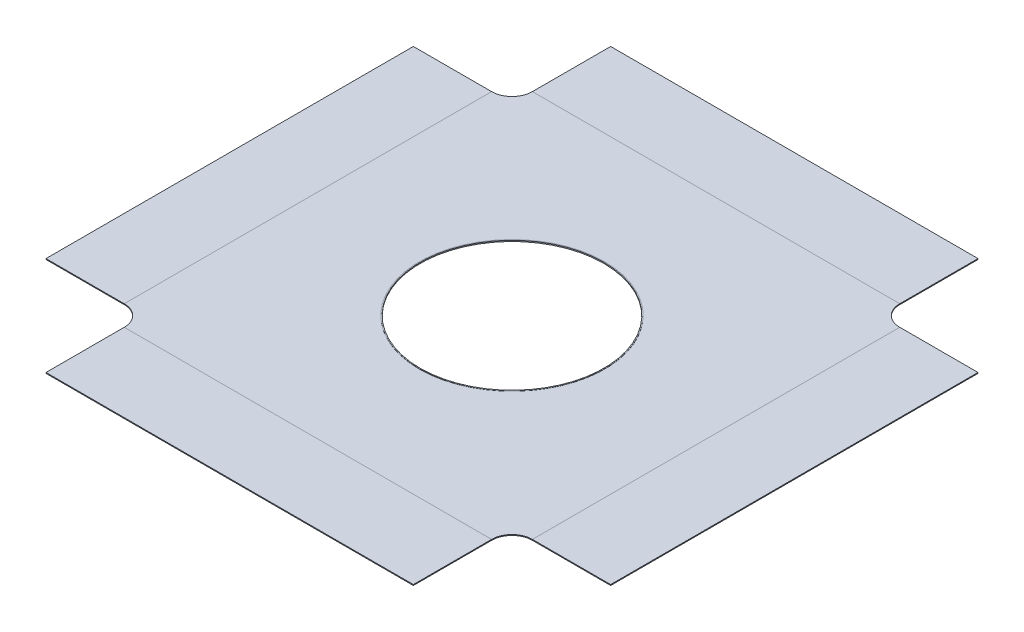
ISO-10303-21;
HEADER;
FILE_DESCRIPTION(('STEP AP214'),'2;1');
FILE_NAME('part.step','',(''),(''),'','','');
FILE_SCHEMA(('AUTOMOTIVE_DESIGN { 1 0 10303 214 1 1 1 1 }'));
ENDSEC;
DATA;
#1=APPLICATION_CONTEXT('core data for automotive mechanical design processes');
#2=APPLICATION_PROTOCOL_DEFINITION('international standard','automotive_design',2000,#1);
#3=PRODUCT_CONTEXT('',#1,'mechanical');
#4=PRODUCT('Part','Part','',(#3));
#5=PRODUCT_RELATED_PRODUCT_CATEGORY('part','',(#4));
#6=PRODUCT_DEFINITION_FORMATION('','',#4);
#7=PRODUCT_DEFINITION_CONTEXT('part definition',#1,'design');
#8=PRODUCT_DEFINITION('design','',#6,#7);
#9=PRODUCT_DEFINITION_SHAPE('','',#8);
#10=(LENGTH_UNIT() NAMED_UNIT(*) SI_UNIT(.MILLI.,.METRE.));
#11=(NAMED_UNIT(*) PLANE_ANGLE_UNIT() SI_UNIT($,.RADIAN.));
#12=(NAMED_UNIT(*) SI_UNIT($,.STERADIAN.) SOLID_ANGLE_UNIT());
#13=UNCERTAINTY_MEASURE_WITH_UNIT(LENGTH_MEASURE(1.E-05),#10,'distance_accuracy_value','');
#14=(GEOMETRIC_REPRESENTATION_CONTEXT(3) GLOBAL_UNCERTAINTY_ASSIGNED_CONTEXT((#13)) GLOBAL_UNIT_ASSIGNED_CONTEXT((#10,
#11,#12)) REPRESENTATION_CONTEXT('',''));
#15=CARTESIAN_POINT('',(0.,0.,0.));
#16=DIRECTION('',(0.,0.,1.));
#17=DIRECTION('',(1.,0.,0.));
#18=AXIS2_PLACEMENT_3D('',#15,#16,#17);
#19=CARTESIAN_POINT('',(0.,0.4064,0.));
#20=DIRECTION('',(0.,-1.,0.));
#21=DIRECTION('',(0.,0.,-1.));
#22=AXIS2_PLACEMENT_3D('',#19,#20,#21);
#23=PLANE('',#22);
#24=DIRECTION('',(-1.,0.,0.));
#25=VECTOR('',#24,1.);
#26=CARTESIAN_POINT('',(0.,0.4064,190.5));
#27=LINE('',#26,#25);
#28=CARTESIAN_POINT('',(171.449999999998,0.4064,190.5));
#29=VERTEX_POINT('',#28);
#30=CARTESIAN_POINT('',(-171.450000000002,0.4064,190.5));
#31=VERTEX_POINT('',#30);
#32=EDGE_CURVE('E57',#29,#31,#27,.T.);
#33=ORIENTED_EDGE('',*,*,#32,.F.);
#34=CARTESIAN_POINT('',(190.499999999998,0.4064,190.5));
#35=DIRECTION('',(0.,-1.,0.));
#36=DIRECTION('',(0.,0.,-1.));
#37=AXIS2_PLACEMENT_3D('',#34,#35,#36);
#38=CIRCLE('',#37,19.05);
#39=CARTESIAN_POINT('',(190.499999999998,0.4064,171.45));
#40=VERTEX_POINT('',#39);
#41=EDGE_CURVE('E327',#29,#40,#38,.T.);
#42=ORIENTED_EDGE('',*,*,#41,.T.);
#43=DIRECTION('',(0.,0.,1.));
#44=VECTOR('',#43,1.);
#45=CARTESIAN_POINT('',(190.499999999999,0.4064,1.05975834168764E-12));
#46=LINE('',#45,#44);
#47=CARTESIAN_POINT('',(190.5,0.4064,-171.45));
#48=VERTEX_POINT('',#47);
#49=EDGE_CURVE('E354',#48,#40,#46,.T.);
#50=ORIENTED_EDGE('',*,*,#49,.F.);
#51=CARTESIAN_POINT('',(190.5,0.4064,-190.5));
#52=DIRECTION('',(0.,-1.,0.));
#53=DIRECTION('',(0.,0.,-1.));
#54=AXIS2_PLACEMENT_3D('',#51,#52,#53);
#55=CIRCLE('',#54,19.05);
#56=CARTESIAN_POINT('',(171.45,0.4064,-190.5));
#57=VERTEX_POINT('',#56);
#58=EDGE_CURVE('E335',#48,#57,#55,.T.);
#59=ORIENTED_EDGE('',*,*,#58,.T.);
#60=DIRECTION('',(1.,0.,0.));
#61=VECTOR('',#60,1.);
#62=CARTESIAN_POINT('',(0.,0.4064,-190.5));
#63=LINE('',#62,#61);
#64=CARTESIAN_POINT('',(-171.449999999999,0.4064,-190.5));
#65=VERTEX_POINT('',#64);
#66=EDGE_CURVE('E64',#65,#57,#63,.T.);
#67=ORIENTED_EDGE('',*,*,#66,.F.);
#68=CARTESIAN_POINT('',(-190.499999999999,0.4064,-190.5));
#69=DIRECTION('',(0.,-1.,0.));
#70=DIRECTION('',(0.,0.,-1.));
#71=AXIS2_PLACEMENT_3D('',#68,#69,#70);
#72=CIRCLE('',#71,19.05);
#73=CARTESIAN_POINT('',(-190.499999999999,0.4064,-171.45));
#74=VERTEX_POINT('',#73);
#75=EDGE_CURVE('E313',#65,#74,#72,.T.);
#76=ORIENTED_EDGE('',*,*,#75,.T.);
#77=DIRECTION('',(0.,0.,-1.));
#78=VECTOR('',#77,1.);
#79=CARTESIAN_POINT('',(-190.500000000001,0.4064,-1.45338286860021E-12));
#80=LINE('',#79,#78);
#81=CARTESIAN_POINT('',(-190.500000000002,0.4064,171.45));
#82=VERTEX_POINT('',#81);
#83=EDGE_CURVE('E345',#82,#74,#80,.T.);
#84=ORIENTED_EDGE('',*,*,#83,.F.);
#85=CARTESIAN_POINT('',(-190.500000000002,0.4064,190.5));
#86=DIRECTION('',(0.,-1.,0.));
#87=DIRECTION('',(0.,0.,-1.));
#88=AXIS2_PLACEMENT_3D('',#85,#86,#87);
#89=CIRCLE('',#88,19.05);
#90=EDGE_CURVE('E324',#82,#31,#89,.T.);
#91=ORIENTED_EDGE('',*,*,#90,.T.);
#92=EDGE_LOOP('',(#33,#42,#50,#59,#67,#76,#84,#91));
#93=FACE_BOUND('',#92,.T.);
#94=CARTESIAN_POINT('',(0.,0.4064,0.));
#95=DIRECTION('',(0.,-1.,0.));
#96=DIRECTION('',(0.,0.,-1.));
#97=AXIS2_PLACEMENT_3D('',#94,#95,#96);
#98=CIRCLE('',#97,86.58225);
#99=CARTESIAN_POINT('',(0.,0.4064,-86.58225));
#100=VERTEX_POINT('',#99);
#101=EDGE_CURVE('E13',#100,#100,#98,.F.);
#102=ORIENTED_EDGE('',*,*,#101,.F.);
#103=EDGE_LOOP('',(#102));
#104=FACE_BOUND('',#103,.T.);
#105=ADVANCED_FACE('F48',(#93,#104),#23,.F.);
#106=DIRECTION('',(0.,0.,-1.));
#107=VECTOR('',#106,1.);
#108=CARTESIAN_POINT('',(171.449999999997,0.4064,263.525000000002));
#109=LINE('',#108,#107);
#110=CARTESIAN_POINT('',(171.449999999997,0.4064,263.525000000002));
#111=VERTEX_POINT('',#110);
#112=EDGE_CURVE('E192',#111,#29,#109,.T.);
#113=ORIENTED_EDGE('',*,*,#112,.T.);
#114=ORIENTED_EDGE('',*,*,#32,.T.);
#115=DIRECTION('',(0.,0.,-1.));
#116=VECTOR('',#115,1.);
#117=CARTESIAN_POINT('',(-171.450000000003,0.4064,263.524999999998));
#118=LINE('',#117,#116);
#119=CARTESIAN_POINT('',(-171.450000000003,0.4064,263.524999999998));
#120=VERTEX_POINT('',#119);
#121=EDGE_CURVE('E178',#120,#31,#118,.T.);
#122=ORIENTED_EDGE('',*,*,#121,.F.);
#123=DIRECTION('',(-1.,0.,0.));
#124=VECTOR('',#123,1.);
#125=CARTESIAN_POINT('',(171.449999999997,0.4064,263.525000000002));
#126=LINE('',#125,#124);
#127=EDGE_CURVE('E163',#111,#120,#126,.T.);
#128=ORIENTED_EDGE('',*,*,#127,.F.);
#129=EDGE_LOOP('',(#113,#114,#122,#128));
#130=FACE_BOUND('',#129,.T.);
#131=ADVANCED_FACE('F179',(#130),#23,.F.);
#132=CARTESIAN_POINT('',(0.,-0.4064,0.));
#133=DIRECTION('',(0.,-1.,0.));
#134=DIRECTION('',(0.,0.,-1.));
#135=AXIS2_PLACEMENT_3D('',#132,#133,#134);
#136=PLANE('',#135);
#137=CARTESIAN_POINT('',(0.,-0.406400000000001,0.));
#138=DIRECTION('',(0.,-1.,0.));
#139=DIRECTION('',(0.,0.,-1.));
#140=AXIS2_PLACEMENT_3D('',#137,#138,#139);
#141=CIRCLE('',#140,85.725);
#142=CARTESIAN_POINT('',(0.,-0.406400000000001,-85.725));
#143=VERTEX_POINT('',#142);
#144=EDGE_CURVE('E186',#143,#143,#141,.T.);
#145=ORIENTED_EDGE('',*,*,#144,.F.);
#146=EDGE_LOOP('',(#145));
#147=FACE_BOUND('',#146,.T.);
#148=CARTESIAN_POINT('',(190.499999999998,-0.4064,190.5));
#149=DIRECTION('',(0.,-1.,0.));
#150=DIRECTION('',(0.,0.,-1.));
#151=AXIS2_PLACEMENT_3D('',#148,#149,#150);
#152=CIRCLE('',#151,19.05);
#153=CARTESIAN_POINT('',(190.499999999998,-0.4064,171.45));
#154=VERTEX_POINT('',#153);
#155=CARTESIAN_POINT('',(171.449999999998,-0.4064,190.5));
#156=VERTEX_POINT('',#155);
#157=EDGE_CURVE('E331',#154,#156,#152,.F.);
#158=ORIENTED_EDGE('',*,*,#157,.T.);
#159=DIRECTION('',(-1.,0.,0.));
#160=VECTOR('',#159,1.);
#161=CARTESIAN_POINT('',(0.,-0.4064,190.5));
#162=LINE('',#161,#160);
#163=CARTESIAN_POINT('',(-171.450000000002,-0.4064,190.5));
#164=VERTEX_POINT('',#163);
#165=EDGE_CURVE('E350',#156,#164,#162,.T.);
#166=ORIENTED_EDGE('',*,*,#165,.T.);
#167=CARTESIAN_POINT('',(-190.500000000002,-0.4064,190.5));
#168=DIRECTION('',(0.,-1.,0.));
#169=DIRECTION('',(0.,0.,-1.));
#170=AXIS2_PLACEMENT_3D('',#167,#168,#169);
#171=CIRCLE('',#170,19.05);
#172=CARTESIAN_POINT('',(-190.500000000002,-0.4064,171.45));
#173=VERTEX_POINT('',#172);
#174=EDGE_CURVE('E320',#164,#173,#171,.F.);
#175=ORIENTED_EDGE('',*,*,#174,.T.);
#176=DIRECTION('',(0.,0.,-1.));
#177=VECTOR('',#176,1.);
#178=CARTESIAN_POINT('',(-190.500000000001,-0.4064,-1.45338286860021E-12));
#179=LINE('',#178,#177);
#180=CARTESIAN_POINT('',(-190.499999999999,-0.4064,-171.45));
#181=VERTEX_POINT('',#180);
#182=EDGE_CURVE('E341',#173,#181,#179,.T.);
#183=ORIENTED_EDGE('',*,*,#182,.T.);
#184=CARTESIAN_POINT('',(-190.499999999999,-0.4064,-190.5));
#185=DIRECTION('',(0.,-1.,0.));
#186=DIRECTION('',(0.,0.,-1.));
#187=AXIS2_PLACEMENT_3D('',#184,#185,#186);
#188=CIRCLE('',#187,19.05);
#189=CARTESIAN_POINT('',(-171.449999999999,-0.4064,-190.5));
#190=VERTEX_POINT('',#189);
#191=EDGE_CURVE('E317',#181,#190,#188,.F.);
#192=ORIENTED_EDGE('',*,*,#191,.T.);
#193=DIRECTION('',(1.,0.,0.));
#194=VECTOR('',#193,1.);
#195=CARTESIAN_POINT('',(0.,-0.4064,-190.5));
#196=LINE('',#195,#194);
#197=CARTESIAN_POINT('',(171.45,-0.4064,-190.5));
#198=VERTEX_POINT('',#197);
#199=EDGE_CURVE('E72',#190,#198,#196,.T.);
#200=ORIENTED_EDGE('',*,*,#199,.T.);
#201=CARTESIAN_POINT('',(190.5,-0.4064,-190.5));
#202=DIRECTION('',(0.,-1.,0.));
#203=DIRECTION('',(0.,0.,-1.));
#204=AXIS2_PLACEMENT_3D('',#201,#202,#203);
#205=CIRCLE('',#204,19.05);
#206=CARTESIAN_POINT('',(190.5,-0.4064,-171.45));
#207=VERTEX_POINT('',#206);
#208=EDGE_CURVE('E338',#198,#207,#205,.F.);
#209=ORIENTED_EDGE('',*,*,#208,.T.);
#210=DIRECTION('',(0.,0.,1.));
#211=VECTOR('',#210,1.);
#212=CARTESIAN_POINT('',(190.499999999999,-0.4064,1.05975834168764E-12));
#213=LINE('',#212,#211);
#214=EDGE_CURVE('E358',#207,#154,#213,.T.);
#215=ORIENTED_EDGE('',*,*,#214,.T.);
#216=EDGE_LOOP('',(#158,#166,#175,#183,#192,#200,#209,#215));
#217=FACE_BOUND('',#216,.T.);
#218=ADVANCED_FACE('F403',(#147,#217),#136,.T.);
#219=DIRECTION('',(-1.,0.,0.));
#220=VECTOR('',#219,1.);
#221=CARTESIAN_POINT('',(263.525,0.4064,-171.45));
#222=LINE('',#221,#220);
#223=CARTESIAN_POINT('',(263.525,0.4064,-171.45));
#224=VERTEX_POINT('',#223);
#225=EDGE_CURVE('E204',#224,#48,#222,.T.);
#226=ORIENTED_EDGE('',*,*,#225,.T.);
#227=ORIENTED_EDGE('',*,*,#49,.T.);
#228=DIRECTION('',(1.,0.,0.));
#229=VECTOR('',#228,1.);
#230=CARTESIAN_POINT('',(-171.45,0.4064,171.45));
#231=LINE('',#230,#229);
#232=CARTESIAN_POINT('',(263.525,0.4064,171.45));
#233=VERTEX_POINT('',#232);
#234=EDGE_CURVE('E268',#40,#233,#231,.T.);
#235=ORIENTED_EDGE('',*,*,#234,.T.);
#236=DIRECTION('',(0.,0.,1.));
#237=VECTOR('',#236,1.);
#238=CARTESIAN_POINT('',(263.525,0.4064,-171.45));
#239=LINE('',#238,#237);
#240=EDGE_CURVE('E209',#224,#233,#239,.T.);
#241=ORIENTED_EDGE('',*,*,#240,.F.);
#242=EDGE_LOOP('',(#226,#227,#235,#241));
#243=FACE_BOUND('',#242,.T.);
#244=ADVANCED_FACE('F404',(#243),#23,.F.);
#245=ORIENTED_EDGE('',*,*,#165,.F.);
#246=DIRECTION('',(0.,0.,-1.));
#247=VECTOR('',#246,1.);
#248=CARTESIAN_POINT('',(171.449999999997,-0.4064,263.525000000002));
#249=LINE('',#248,#247);
#250=CARTESIAN_POINT('',(171.449999999997,-0.4064,263.525000000002));
#251=VERTEX_POINT('',#250);
#252=EDGE_CURVE('E197',#251,#156,#249,.T.);
#253=ORIENTED_EDGE('',*,*,#252,.F.);
#254=DIRECTION('',(1.,0.,0.));
#255=VECTOR('',#254,1.);
#256=CARTESIAN_POINT('',(-171.450000000003,-0.4064,263.524999999998));
#257=LINE('',#256,#255);
#258=CARTESIAN_POINT('',(-171.450000000003,-0.4064,263.524999999998));
#259=VERTEX_POINT('',#258);
#260=EDGE_CURVE('E191',#259,#251,#257,.T.);
#261=ORIENTED_EDGE('',*,*,#260,.F.);
#262=DIRECTION('',(0.,0.,-1.));
#263=VECTOR('',#262,1.);
#264=CARTESIAN_POINT('',(-171.450000000003,-0.4064,263.524999999998));
#265=LINE('',#264,#263);
#266=EDGE_CURVE('E185',#259,#164,#265,.T.);
#267=ORIENTED_EDGE('',*,*,#266,.T.);
#268=EDGE_LOOP('',(#245,#253,#261,#267));
#269=FACE_BOUND('',#268,.T.);
#270=ADVANCED_FACE('F421',(#269),#136,.T.);
#271=DIRECTION('',(0.,0.,1.));
#272=VECTOR('',#271,1.);
#273=CARTESIAN_POINT('',(-171.449999999999,0.4064,-263.525000000001));
#274=LINE('',#273,#272);
#275=CARTESIAN_POINT('',(-171.449999999999,0.4064,-263.525000000001));
#276=VERTEX_POINT('',#275);
#277=EDGE_CURVE('E236',#276,#65,#274,.T.);
#278=ORIENTED_EDGE('',*,*,#277,.T.);
#279=ORIENTED_EDGE('',*,*,#66,.T.);
#280=DIRECTION('',(0.,0.,-1.));
#281=VECTOR('',#280,1.);
#282=CARTESIAN_POINT('',(171.45,0.4064,171.45));
#283=LINE('',#282,#281);
#284=CARTESIAN_POINT('',(171.450000000001,0.4064,-263.524999999999));
#285=VERTEX_POINT('',#284);
#286=EDGE_CURVE('E264',#57,#285,#283,.T.);
#287=ORIENTED_EDGE('',*,*,#286,.T.);
#288=DIRECTION('',(1.,0.,0.));
#289=VECTOR('',#288,1.);
#290=CARTESIAN_POINT('',(-171.449999999999,0.4064,-263.525000000001));
#291=LINE('',#290,#289);
#292=EDGE_CURVE('E232',#276,#285,#291,.T.);
#293=ORIENTED_EDGE('',*,*,#292,.F.);
#294=EDGE_LOOP('',(#278,#279,#287,#293));
#295=FACE_BOUND('',#294,.T.);
#296=ADVANCED_FACE('F412',(#295),#23,.F.);
#297=ORIENTED_EDGE('',*,*,#214,.F.);
#298=DIRECTION('',(-1.,0.,0.));
#299=VECTOR('',#298,1.);
#300=CARTESIAN_POINT('',(263.525,-0.4064,-171.45));
#301=LINE('',#300,#299);
#302=CARTESIAN_POINT('',(263.525,-0.4064,-171.45));
#303=VERTEX_POINT('',#302);
#304=EDGE_CURVE('E175',#303,#207,#301,.T.);
#305=ORIENTED_EDGE('',*,*,#304,.F.);
#306=DIRECTION('',(0.,0.,-1.));
#307=VECTOR('',#306,1.);
#308=CARTESIAN_POINT('',(263.525,-0.4064,171.45));
#309=LINE('',#308,#307);
#310=CARTESIAN_POINT('',(263.525,-0.4064,171.45));
#311=VERTEX_POINT('',#310);
#312=EDGE_CURVE('E217',#311,#303,#309,.T.);
#313=ORIENTED_EDGE('',*,*,#312,.F.);
#314=DIRECTION('',(1.,0.,0.));
#315=VECTOR('',#314,1.);
#316=CARTESIAN_POINT('',(-171.45,-0.4064,171.45));
#317=LINE('',#316,#315);
#318=EDGE_CURVE('E280',#154,#311,#317,.T.);
#319=ORIENTED_EDGE('',*,*,#318,.F.);
#320=EDGE_LOOP('',(#297,#305,#313,#319));
#321=FACE_BOUND('',#320,.T.);
#322=ADVANCED_FACE('F410',(#321),#136,.T.);
#323=CARTESIAN_POINT('',(-263.525,0.4064,171.45));
#324=VERTEX_POINT('',#323);
#325=EDGE_CURVE('E269',#324,#82,#231,.T.);
#326=ORIENTED_EDGE('',*,*,#325,.T.);
#327=ORIENTED_EDGE('',*,*,#83,.T.);
#328=DIRECTION('',(1.,0.,0.));
#329=VECTOR('',#328,1.);
#330=CARTESIAN_POINT('',(-171.45,0.4064,-171.45));
#331=LINE('',#330,#329);
#332=CARTESIAN_POINT('',(-263.525,0.4064,-171.45));
#333=VERTEX_POINT('',#332);
#334=EDGE_CURVE('E260',#333,#74,#331,.T.);
#335=ORIENTED_EDGE('',*,*,#334,.F.);
#336=DIRECTION('',(0.,0.,-1.));
#337=VECTOR('',#336,1.);
#338=CARTESIAN_POINT('',(-263.525,0.4064,171.45));
#339=LINE('',#338,#337);
#340=EDGE_CURVE('E255',#324,#333,#339,.T.);
#341=ORIENTED_EDGE('',*,*,#340,.F.);
#342=EDGE_LOOP('',(#326,#327,#335,#341));
#343=FACE_BOUND('',#342,.T.);
#344=ADVANCED_FACE('F399',(#343),#23,.F.);
#345=ORIENTED_EDGE('',*,*,#199,.F.);
#346=DIRECTION('',(0.,0.,1.));
#347=VECTOR('',#346,1.);
#348=CARTESIAN_POINT('',(-171.449999999999,-0.4064,-263.525000000001));
#349=LINE('',#348,#347);
#350=CARTESIAN_POINT('',(-171.449999999999,-0.4064,-263.525000000001));
#351=VERTEX_POINT('',#350);
#352=EDGE_CURVE('E239',#351,#190,#349,.T.);
#353=ORIENTED_EDGE('',*,*,#352,.F.);
#354=DIRECTION('',(-1.,0.,0.));
#355=VECTOR('',#354,1.);
#356=CARTESIAN_POINT('',(171.450000000001,-0.4064,-263.524999999999));
#357=LINE('',#356,#355);
#358=CARTESIAN_POINT('',(171.450000000001,-0.4064,-263.524999999999));
#359=VERTEX_POINT('',#358);
#360=EDGE_CURVE('E226',#359,#351,#357,.T.);
#361=ORIENTED_EDGE('',*,*,#360,.F.);
#362=DIRECTION('',(0.,0.,-1.));
#363=VECTOR('',#362,1.);
#364=CARTESIAN_POINT('',(171.45,-0.4064,171.45));
#365=LINE('',#364,#363);
#366=EDGE_CURVE('E277',#198,#359,#365,.T.);
#367=ORIENTED_EDGE('',*,*,#366,.F.);
#368=EDGE_LOOP('',(#345,#353,#361,#367));
#369=FACE_BOUND('',#368,.T.);
#370=ADVANCED_FACE('F409',(#369),#136,.T.);
#371=CARTESIAN_POINT('',(-171.45,0.4064,171.45));
#372=DIRECTION('',(0.,0.,-1.));
#373=DIRECTION('',(-1.,0.,0.));
#374=AXIS2_PLACEMENT_3D('',#371,#372,#373);
#375=PLANE('',#374);
#376=CARTESIAN_POINT('',(-263.525,-0.4064,171.45));
#377=VERTEX_POINT('',#376);
#378=EDGE_CURVE('E265',#377,#173,#317,.T.);
#379=ORIENTED_EDGE('',*,*,#378,.T.);
#380=DIRECTION('',(0.,-1.,0.));
#381=VECTOR('',#380,1.);
#382=CARTESIAN_POINT('',(-190.500000000002,0.4064,171.45));
#383=LINE('',#382,#381);
#384=EDGE_CURVE('E294',#173,#82,#383,.F.);
#385=ORIENTED_EDGE('',*,*,#384,.T.);
#386=ORIENTED_EDGE('',*,*,#325,.F.);
#387=DIRECTION('',(0.,1.,0.));
#388=VECTOR('',#387,1.);
#389=CARTESIAN_POINT('',(-263.525,-0.4064,171.45));
#390=LINE('',#389,#388);
#391=EDGE_CURVE('E251',#377,#324,#390,.T.);
#392=ORIENTED_EDGE('',*,*,#391,.F.);
#393=EDGE_LOOP('',(#379,#385,#386,#392));
#394=FACE_BOUND('',#393,.T.);
#395=ADVANCED_FACE('F417',(#394),#375,.F.);
#396=ORIENTED_EDGE('',*,*,#234,.F.);
#397=DIRECTION('',(0.,1.,0.));
#398=VECTOR('',#397,1.);
#399=CARTESIAN_POINT('',(190.499999999998,-0.4064,171.45));
#400=LINE('',#399,#398);
#401=EDGE_CURVE('E302',#40,#154,#400,.F.);
#402=ORIENTED_EDGE('',*,*,#401,.T.);
#403=ORIENTED_EDGE('',*,*,#318,.T.);
#404=DIRECTION('',(0.,-1.,0.));
#405=VECTOR('',#404,1.);
#406=CARTESIAN_POINT('',(263.525,0.4064,171.45));
#407=LINE('',#406,#405);
#408=EDGE_CURVE('E208',#233,#311,#407,.T.);
#409=ORIENTED_EDGE('',*,*,#408,.F.);
#410=EDGE_LOOP('',(#396,#402,#403,#409));
#411=FACE_BOUND('',#410,.T.);
#412=ADVANCED_FACE('F490',(#411),#375,.F.);
#413=CARTESIAN_POINT('',(171.45,0.4064,171.45));
#414=DIRECTION('',(-1.,0.,0.));
#415=DIRECTION('',(0.,0.,1.));
#416=AXIS2_PLACEMENT_3D('',#413,#414,#415);
#417=PLANE('',#416);
#418=ORIENTED_EDGE('',*,*,#286,.F.);
#419=DIRECTION('',(0.,1.,0.));
#420=VECTOR('',#419,1.);
#421=CARTESIAN_POINT('',(171.45,-0.4064,-190.5));
#422=LINE('',#421,#420);
#423=EDGE_CURVE('E310',#57,#198,#422,.F.);
#424=ORIENTED_EDGE('',*,*,#423,.T.);
#425=ORIENTED_EDGE('',*,*,#366,.T.);
#426=DIRECTION('',(0.,-1.,0.));
#427=VECTOR('',#426,1.);
#428=CARTESIAN_POINT('',(171.450000000001,0.4064,-263.524999999999));
#429=LINE('',#428,#427);
#430=EDGE_CURVE('E213',#285,#359,#429,.T.);
#431=ORIENTED_EDGE('',*,*,#430,.F.);
#432=EDGE_LOOP('',(#418,#424,#425,#431));
#433=FACE_BOUND('',#432,.T.);
#434=ADVANCED_FACE('F448',(#433),#417,.F.);
#435=CARTESIAN_POINT('',(-171.45,0.4064,-171.45));
#436=DIRECTION('',(0.,0.,-1.));
#437=DIRECTION('',(-1.,0.,0.));
#438=AXIS2_PLACEMENT_3D('',#435,#436,#437);
#439=PLANE('',#438);
#440=ORIENTED_EDGE('',*,*,#334,.T.);
#441=DIRECTION('',(0.,1.,0.));
#442=VECTOR('',#441,1.);
#443=CARTESIAN_POINT('',(-190.499999999999,0.4064,-171.45));
#444=LINE('',#443,#442);
#445=EDGE_CURVE('E287',#74,#181,#444,.F.);
#446=ORIENTED_EDGE('',*,*,#445,.T.);
#447=DIRECTION('',(1.,0.,0.));
#448=VECTOR('',#447,1.);
#449=CARTESIAN_POINT('',(-171.45,-0.4064,-171.45));
#450=LINE('',#449,#448);
#451=CARTESIAN_POINT('',(-263.525,-0.4064,-171.45));
#452=VERTEX_POINT('',#451);
#453=EDGE_CURVE('E259',#452,#181,#450,.T.);
#454=ORIENTED_EDGE('',*,*,#453,.F.);
#455=DIRECTION('',(0.,-1.,0.));
#456=VECTOR('',#455,1.);
#457=CARTESIAN_POINT('',(-263.525,0.4064,-171.45));
#458=LINE('',#457,#456);
#459=EDGE_CURVE('E243',#333,#452,#458,.T.);
#460=ORIENTED_EDGE('',*,*,#459,.F.);
#461=EDGE_LOOP('',(#440,#446,#454,#460));
#462=FACE_BOUND('',#461,.T.);
#463=ADVANCED_FACE('F466',(#462),#439,.T.);
#464=ORIENTED_EDGE('',*,*,#182,.F.);
#465=ORIENTED_EDGE('',*,*,#378,.F.);
#466=DIRECTION('',(0.,0.,1.));
#467=VECTOR('',#466,1.);
#468=CARTESIAN_POINT('',(-263.525,-0.4064,-171.45));
#469=LINE('',#468,#467);
#470=EDGE_CURVE('E247',#452,#377,#469,.T.);
#471=ORIENTED_EDGE('',*,*,#470,.F.);
#472=ORIENTED_EDGE('',*,*,#453,.T.);
#473=EDGE_LOOP('',(#464,#465,#471,#472));
#474=FACE_BOUND('',#473,.T.);
#475=ADVANCED_FACE('F419',(#474),#136,.T.);
#476=CARTESIAN_POINT('',(-263.525,0.,0.));
#477=DIRECTION('',(-1.,0.,0.));
#478=DIRECTION('',(0.,0.,1.));
#479=AXIS2_PLACEMENT_3D('',#476,#477,#478);
#480=PLANE('',#479);
#481=ORIENTED_EDGE('',*,*,#459,.T.);
#482=ORIENTED_EDGE('',*,*,#470,.T.);
#483=ORIENTED_EDGE('',*,*,#391,.T.);
#484=ORIENTED_EDGE('',*,*,#340,.T.);
#485=EDGE_LOOP('',(#481,#482,#483,#484));
#486=FACE_BOUND('',#485,.T.);
#487=ADVANCED_FACE('F469',(#486),#480,.T.);
#488=CARTESIAN_POINT('',(-171.449999999999,-0.4064,-263.525000000001));
#489=DIRECTION('',(1.,0.,0.));
#490=DIRECTION('',(0.,0.,-1.));
#491=AXIS2_PLACEMENT_3D('',#488,#489,#490);
#492=PLANE('',#491);
#493=ORIENTED_EDGE('',*,*,#352,.T.);
#494=DIRECTION('',(0.,1.,0.));
#495=VECTOR('',#494,1.);
#496=CARTESIAN_POINT('',(-171.449999999999,-0.4064,-190.5));
#497=LINE('',#496,#495);
#498=EDGE_CURVE('E273',#190,#65,#497,.T.);
#499=ORIENTED_EDGE('',*,*,#498,.T.);
#500=ORIENTED_EDGE('',*,*,#277,.F.);
#501=DIRECTION('',(0.,1.,0.));
#502=VECTOR('',#501,1.);
#503=CARTESIAN_POINT('',(-171.449999999999,-0.4064,-263.525000000001));
#504=LINE('',#503,#502);
#505=EDGE_CURVE('E229',#351,#276,#504,.T.);
#506=ORIENTED_EDGE('',*,*,#505,.F.);
#507=EDGE_LOOP('',(#493,#499,#500,#506));
#508=FACE_BOUND('',#507,.T.);
#509=ADVANCED_FACE('F458',(#508),#492,.F.);
#510=CARTESIAN_POINT('',(9.20092619818637E-13,0.,-263.525));
#511=DIRECTION('',(0.,0.,-1.));
#512=DIRECTION('',(-1.,0.,0.));
#513=AXIS2_PLACEMENT_3D('',#510,#511,#512);
#514=PLANE('',#513);
#515=ORIENTED_EDGE('',*,*,#430,.T.);
#516=ORIENTED_EDGE('',*,*,#360,.T.);
#517=ORIENTED_EDGE('',*,*,#505,.T.);
#518=ORIENTED_EDGE('',*,*,#292,.T.);
#519=EDGE_LOOP('',(#515,#516,#517,#518));
#520=FACE_BOUND('',#519,.T.);
#521=ADVANCED_FACE('F452',(#520),#514,.T.);
#522=CARTESIAN_POINT('',(263.525,-0.4064,-171.45));
#523=DIRECTION('',(0.,0.,1.));
#524=DIRECTION('',(1.,0.,0.));
#525=AXIS2_PLACEMENT_3D('',#522,#523,#524);
#526=PLANE('',#525);
#527=ORIENTED_EDGE('',*,*,#304,.T.);
#528=DIRECTION('',(0.,1.,0.));
#529=VECTOR('',#528,1.);
#530=CARTESIAN_POINT('',(190.5,0.4064,-171.45));
#531=LINE('',#530,#529);
#532=EDGE_CURVE('E306',#207,#48,#531,.T.);
#533=ORIENTED_EDGE('',*,*,#532,.T.);
#534=ORIENTED_EDGE('',*,*,#225,.F.);
#535=DIRECTION('',(0.,1.,0.));
#536=VECTOR('',#535,1.);
#537=CARTESIAN_POINT('',(263.525,-0.4064,-171.45));
#538=LINE('',#537,#536);
#539=EDGE_CURVE('E214',#303,#224,#538,.T.);
#540=ORIENTED_EDGE('',*,*,#539,.F.);
#541=EDGE_LOOP('',(#527,#533,#534,#540));
#542=FACE_BOUND('',#541,.T.);
#543=ADVANCED_FACE('F437',(#542),#526,.F.);
#544=CARTESIAN_POINT('',(263.525,0.,0.));
#545=DIRECTION('',(1.,0.,0.));
#546=DIRECTION('',(0.,0.,-1.));
#547=AXIS2_PLACEMENT_3D('',#544,#545,#546);
#548=PLANE('',#547);
#549=ORIENTED_EDGE('',*,*,#408,.T.);
#550=ORIENTED_EDGE('',*,*,#312,.T.);
#551=ORIENTED_EDGE('',*,*,#539,.T.);
#552=ORIENTED_EDGE('',*,*,#240,.T.);
#553=EDGE_LOOP('',(#549,#550,#551,#552));
#554=FACE_BOUND('',#553,.T.);
#555=ADVANCED_FACE('F494',(#554),#548,.T.);
#556=CARTESIAN_POINT('',(-171.450000000003,0.4064,263.524999999998));
#557=DIRECTION('',(1.,0.,0.));
#558=DIRECTION('',(0.,0.,-1.));
#559=AXIS2_PLACEMENT_3D('',#556,#557,#558);
#560=PLANE('',#559);
#561=ORIENTED_EDGE('',*,*,#121,.T.);
#562=DIRECTION('',(0.,-1.,0.));
#563=VECTOR('',#562,1.);
#564=CARTESIAN_POINT('',(-171.450000000002,-0.4064,190.5));
#565=LINE('',#564,#563);
#566=EDGE_CURVE('E291',#31,#164,#565,.T.);
#567=ORIENTED_EDGE('',*,*,#566,.T.);
#568=ORIENTED_EDGE('',*,*,#266,.F.);
#569=DIRECTION('',(0.,-1.,0.));
#570=VECTOR('',#569,1.);
#571=CARTESIAN_POINT('',(-171.450000000003,0.4064,263.524999999998));
#572=LINE('',#571,#570);
#573=EDGE_CURVE('E167',#120,#259,#572,.T.);
#574=ORIENTED_EDGE('',*,*,#573,.F.);
#575=EDGE_LOOP('',(#561,#567,#568,#574));
#576=FACE_BOUND('',#575,.T.);
#577=ADVANCED_FACE('F188',(#576),#560,.F.);
#578=CARTESIAN_POINT('',(171.449999999997,-0.4064,263.525000000002));
#579=DIRECTION('',(-1.,0.,0.));
#580=DIRECTION('',(0.,0.,1.));
#581=AXIS2_PLACEMENT_3D('',#578,#579,#580);
#582=PLANE('',#581);
#583=ORIENTED_EDGE('',*,*,#252,.T.);
#584=DIRECTION('',(0.,1.,0.));
#585=VECTOR('',#584,1.);
#586=CARTESIAN_POINT('',(171.449999999998,0.4064,190.5));
#587=LINE('',#586,#585);
#588=EDGE_CURVE('E298',#156,#29,#587,.T.);
#589=ORIENTED_EDGE('',*,*,#588,.T.);
#590=ORIENTED_EDGE('',*,*,#112,.F.);
#591=DIRECTION('',(0.,1.,0.));
#592=VECTOR('',#591,1.);
#593=CARTESIAN_POINT('',(171.449999999997,-0.4064,263.525000000002));
#594=LINE('',#593,#592);
#595=EDGE_CURVE('E170',#251,#111,#594,.T.);
#596=ORIENTED_EDGE('',*,*,#595,.F.);
#597=EDGE_LOOP('',(#583,#589,#590,#596));
#598=FACE_BOUND('',#597,.T.);
#599=ADVANCED_FACE('F486',(#598),#582,.F.);
#600=CARTESIAN_POINT('',(-2.76027785945591E-12,0.,263.525));
#601=DIRECTION('',(0.,0.,1.));
#602=DIRECTION('',(1.,0.,0.));
#603=AXIS2_PLACEMENT_3D('',#600,#601,#602);
#604=PLANE('',#603);
#605=ORIENTED_EDGE('',*,*,#573,.T.);
#606=ORIENTED_EDGE('',*,*,#260,.T.);
#607=ORIENTED_EDGE('',*,*,#595,.T.);
#608=ORIENTED_EDGE('',*,*,#127,.T.);
#609=EDGE_LOOP('',(#605,#606,#607,#608));
#610=FACE_BOUND('',#609,.T.);
#611=ADVANCED_FACE('F165',(#610),#604,.T.);
#612=CARTESIAN_POINT('',(-190.499999999999,-0.4064,-190.5));
#613=DIRECTION('',(0.,1.,0.));
#614=DIRECTION('',(0.,0.,1.));
#615=AXIS2_PLACEMENT_3D('',#612,#613,#614);
#616=CYLINDRICAL_SURFACE('',#615,19.05);
#617=ORIENTED_EDGE('',*,*,#191,.F.);
#618=ORIENTED_EDGE('',*,*,#445,.F.);
#619=ORIENTED_EDGE('',*,*,#75,.F.);
#620=ORIENTED_EDGE('',*,*,#498,.F.);
#621=EDGE_LOOP('',(#617,#618,#619,#620));
#622=FACE_BOUND('',#621,.T.);
#623=ADVANCED_FACE('F462',(#622),#616,.F.);
#624=CARTESIAN_POINT('',(-190.500000000002,0.4064,190.5));
#625=DIRECTION('',(0.,1.,0.));
#626=DIRECTION('',(0.,0.,1.));
#627=AXIS2_PLACEMENT_3D('',#624,#625,#626);
#628=CYLINDRICAL_SURFACE('',#627,19.05);
#629=ORIENTED_EDGE('',*,*,#90,.F.);
#630=ORIENTED_EDGE('',*,*,#384,.F.);
#631=ORIENTED_EDGE('',*,*,#174,.F.);
#632=ORIENTED_EDGE('',*,*,#566,.F.);
#633=EDGE_LOOP('',(#629,#630,#631,#632));
#634=FACE_BOUND('',#633,.T.);
#635=ADVANCED_FACE('F476',(#634),#628,.F.);
#636=CARTESIAN_POINT('',(190.499999999998,-0.4064,190.5));
#637=DIRECTION('',(0.,-1.,0.));
#638=DIRECTION('',(0.,0.,-1.));
#639=AXIS2_PLACEMENT_3D('',#636,#637,#638);
#640=CYLINDRICAL_SURFACE('',#639,19.05);
#641=ORIENTED_EDGE('',*,*,#157,.F.);
#642=ORIENTED_EDGE('',*,*,#401,.F.);
#643=ORIENTED_EDGE('',*,*,#41,.F.);
#644=ORIENTED_EDGE('',*,*,#588,.F.);
#645=EDGE_LOOP('',(#641,#642,#643,#644));
#646=FACE_BOUND('',#645,.T.);
#647=ADVANCED_FACE('F484',(#646),#640,.F.);
#648=CARTESIAN_POINT('',(190.5,-0.4064,-190.5));
#649=DIRECTION('',(0.,-1.,0.));
#650=DIRECTION('',(0.,0.,-1.));
#651=AXIS2_PLACEMENT_3D('',#648,#649,#650);
#652=CYLINDRICAL_SURFACE('',#651,19.05);
#653=ORIENTED_EDGE('',*,*,#208,.F.);
#654=ORIENTED_EDGE('',*,*,#423,.F.);
#655=ORIENTED_EDGE('',*,*,#58,.F.);
#656=ORIENTED_EDGE('',*,*,#532,.F.);
#657=EDGE_LOOP('',(#653,#654,#655,#656));
#658=FACE_BOUND('',#657,.T.);
#659=ADVANCED_FACE('F50',(#658),#652,.F.);
#660=CARTESIAN_POINT('',(0.,-88.4936,0.));
#661=DIRECTION('',(0.,1.,0.));
#662=DIRECTION('',(0.,0.,1.));
#663=AXIS2_PLACEMENT_3D('',#660,#661,#662);
#664=CYLINDRICAL_SURFACE('',#663,85.725);
#665=ORIENTED_EDGE('',*,*,#144,.T.);
#666=EDGE_LOOP('',(#665));
#667=FACE_BOUND('',#666,.T.);
#668=CARTESIAN_POINT('',(0.,0.6096,0.));
#669=DIRECTION('',(0.,1.,0.));
#670=DIRECTION('',(0.,0.,1.));
#671=AXIS2_PLACEMENT_3D('',#668,#669,#670);
#672=CIRCLE('',#671,85.725);
#673=CARTESIAN_POINT('',(0.,0.6096,85.725));
#674=VERTEX_POINT('',#673);
#675=EDGE_CURVE('E379',#674,#674,#672,.T.);
#676=ORIENTED_EDGE('',*,*,#675,.T.);
#677=EDGE_LOOP('',(#676));
#678=FACE_BOUND('',#677,.T.);
#679=ADVANCED_FACE('F384',(#667,#678),#664,.F.);
#680=CARTESIAN_POINT('',(0.,0.6096,0.));
#681=DIRECTION('',(0.,-1.,0.));
#682=DIRECTION('',(0.,0.,-1.));
#683=AXIS2_PLACEMENT_3D('',#680,#681,#682);
#684=CYLINDRICAL_SURFACE('',#683,86.58225);
#685=CARTESIAN_POINT('',(0.,0.6096,0.));
#686=DIRECTION('',(0.,1.,0.));
#687=DIRECTION('',(0.,0.,1.));
#688=AXIS2_PLACEMENT_3D('',#685,#686,#687);
#689=CIRCLE('',#688,86.58225);
#690=CARTESIAN_POINT('',(0.,0.6096,86.58225));
#691=VERTEX_POINT('',#690);
#692=EDGE_CURVE('E375',#691,#691,#689,.T.);
#693=ORIENTED_EDGE('',*,*,#692,.F.);
#694=EDGE_LOOP('',(#693));
#695=FACE_BOUND('',#694,.T.);
#696=ORIENTED_EDGE('',*,*,#101,.T.);
#697=EDGE_LOOP('',(#696));
#698=FACE_BOUND('',#697,.T.);
#699=ADVANCED_FACE('F388',(#695,#698),#684,.T.);
#700=CARTESIAN_POINT('',(0.,0.6096,0.));
#701=DIRECTION('',(0.,1.,0.));
#702=DIRECTION('',(0.,0.,1.));
#703=AXIS2_PLACEMENT_3D('',#700,#701,#702);
#704=PLANE('',#703);
#705=ORIENTED_EDGE('',*,*,#692,.T.);
#706=EDGE_LOOP('',(#705));
#707=FACE_BOUND('',#706,.T.);
#708=ORIENTED_EDGE('',*,*,#675,.F.);
#709=EDGE_LOOP('',(#708));
#710=FACE_BOUND('',#709,.T.);
#711=ADVANCED_FACE('F386',(#707,#710),#704,.T.);
#712=CLOSED_SHELL('',(#105,#131,#218,#244,#270,#296,#322,#344,#370,#395,#412,#434,#463,#475,
#487,#509,#521,#543,#555,#577,#599,#611,#623,#635,#647,#659,#679,#699,#711));
#713=MANIFOLD_SOLID_BREP('B2',#712);
#714=ADVANCED_BREP_SHAPE_REPRESENTATION('',(#18,#713),#14);
#715=SHAPE_DEFINITION_REPRESENTATION(#9,#714);
ENDSEC;
END-ISO-10303-21;
